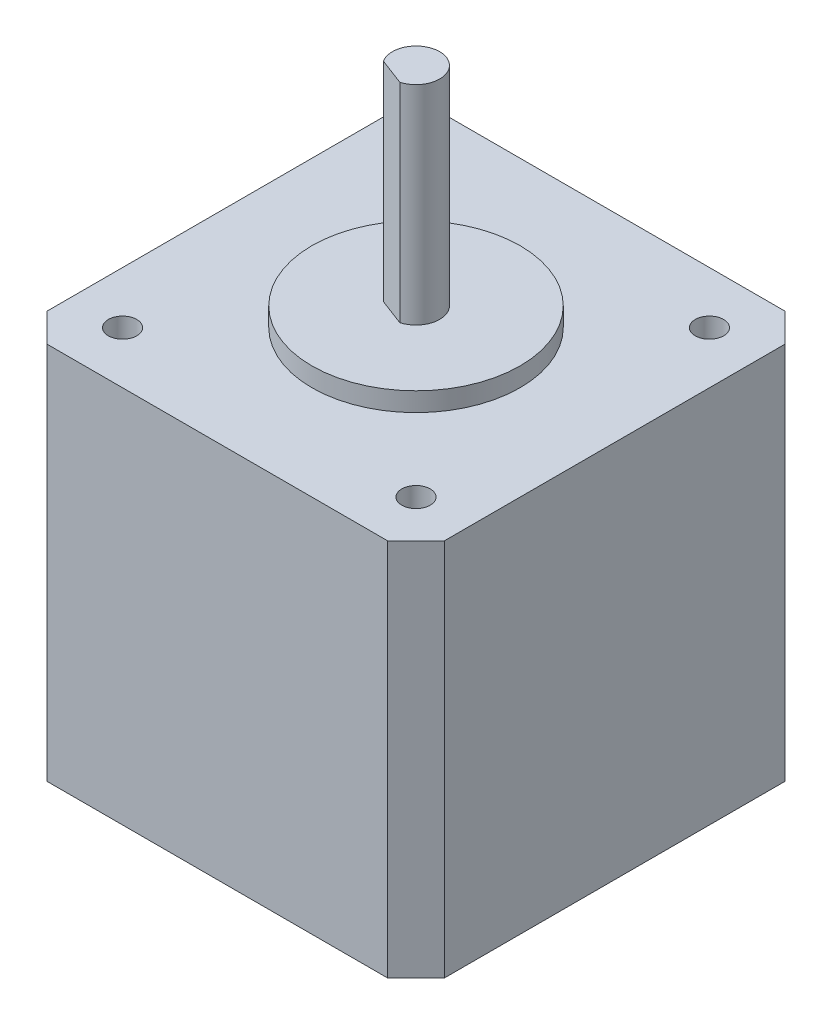
ISO-10303-21;
HEADER;
FILE_DESCRIPTION(('STEP AP214'),'2;1');
FILE_NAME('part.step','',(''),(''),'','','');
FILE_SCHEMA(('AUTOMOTIVE_DESIGN { 1 0 10303 214 1 1 1 1 }'));
ENDSEC;
DATA;
#1=APPLICATION_CONTEXT('core data for automotive mechanical design processes');
#2=APPLICATION_PROTOCOL_DEFINITION('international standard','automotive_design',2000,#1);
#3=PRODUCT_CONTEXT('',#1,'mechanical');
#4=PRODUCT('Part','Part','',(#3));
#5=PRODUCT_RELATED_PRODUCT_CATEGORY('part','',(#4));
#6=PRODUCT_DEFINITION_FORMATION('','',#4);
#7=PRODUCT_DEFINITION_CONTEXT('part definition',#1,'design');
#8=PRODUCT_DEFINITION('design','',#6,#7);
#9=PRODUCT_DEFINITION_SHAPE('','',#8);
#10=(LENGTH_UNIT() NAMED_UNIT(*) SI_UNIT(.MILLI.,.METRE.));
#11=(NAMED_UNIT(*) PLANE_ANGLE_UNIT() SI_UNIT($,.RADIAN.));
#12=(NAMED_UNIT(*) SI_UNIT($,.STERADIAN.) SOLID_ANGLE_UNIT());
#13=UNCERTAINTY_MEASURE_WITH_UNIT(LENGTH_MEASURE(1.E-05),#10,'distance_accuracy_value','');
#14=(GEOMETRIC_REPRESENTATION_CONTEXT(3) GLOBAL_UNCERTAINTY_ASSIGNED_CONTEXT((#13)) GLOBAL_UNIT_ASSIGNED_CONTEXT((#10,
#11,#12)) REPRESENTATION_CONTEXT('',''));
#15=CARTESIAN_POINT('',(0.,0.,0.));
#16=DIRECTION('',(0.,0.,1.));
#17=DIRECTION('',(1.,0.,0.));
#18=AXIS2_PLACEMENT_3D('',#15,#16,#17);
#19=CARTESIAN_POINT('',(21.,64.,-21.));
#20=DIRECTION('',(0.,-1.,0.));
#21=DIRECTION('',(0.,0.,-1.));
#22=AXIS2_PLACEMENT_3D('',#19,#20,#21);
#23=CYLINDRICAL_SURFACE('',#22,2.5);
#24=DIRECTION('',(0.,-1.,0.));
#25=VECTOR('',#24,1.);
#26=CARTESIAN_POINT('',(18.8861996608009,203.144399764715,-19.665141158773));
#27=LINE('',#26,#25);
#28=CARTESIAN_POINT('',(18.8861996608009,64.,-19.665141158773));
#29=VERTEX_POINT('',#28);
#30=CARTESIAN_POINT('',(18.8861996608009,42.,-19.665141158773));
#31=VERTEX_POINT('',#30);
#32=EDGE_CURVE('E121',#29,#31,#27,.T.);
#33=ORIENTED_EDGE('',*,*,#32,.F.);
#34=CARTESIAN_POINT('',(21.,64.,-21.));
#35=DIRECTION('',(0.,1.,0.));
#36=DIRECTION('',(0.,0.,1.));
#37=AXIS2_PLACEMENT_3D('',#34,#35,#36);
#38=CIRCLE('',#37,2.5);
#39=CARTESIAN_POINT('',(21.6896003926022,64.,-18.5969911988253));
#40=VERTEX_POINT('',#39);
#41=EDGE_CURVE('E131',#40,#29,#38,.T.);
#42=ORIENTED_EDGE('',*,*,#41,.F.);
#43=DIRECTION('',(0.,-1.,0.));
#44=VECTOR('',#43,1.);
#45=CARTESIAN_POINT('',(21.6896003926022,203.144399764715,-18.5969911988253));
#46=LINE('',#45,#44);
#47=CARTESIAN_POINT('',(21.6896003926022,42.,-18.5969911988253));
#48=VERTEX_POINT('',#47);
#49=EDGE_CURVE('E55',#40,#48,#46,.T.);
#50=ORIENTED_EDGE('',*,*,#49,.T.);
#51=CARTESIAN_POINT('',(21.,42.,-21.));
#52=DIRECTION('',(0.,1.,0.));
#53=DIRECTION('',(0.,0.,1.));
#54=AXIS2_PLACEMENT_3D('',#51,#52,#53);
#55=CIRCLE('',#54,2.5);
#56=EDGE_CURVE('E11',#48,#31,#55,.T.);
#57=ORIENTED_EDGE('',*,*,#56,.T.);
#58=EDGE_LOOP('',(#33,#42,#50,#57));
#59=FACE_BOUND('',#58,.T.);
#60=ADVANCED_FACE('F38',(#59),#23,.T.);
#61=CARTESIAN_POINT('',(21.,64.,-21.));
#62=DIRECTION('',(0.,1.,0.));
#63=DIRECTION('',(0.,0.,1.));
#64=AXIS2_PLACEMENT_3D('',#61,#62,#63);
#65=PLANE('',#64);
#66=ORIENTED_EDGE('',*,*,#41,.T.);
#67=DIRECTION('',(-0.934466910600416,0.,-0.356049986649227));
#68=VECTOR('',#67,1.);
#69=CARTESIAN_POINT('',(21.6896003926022,64.,-18.5969911988253));
#70=LINE('',#69,#68);
#71=EDGE_CURVE('E126',#40,#29,#70,.T.);
#72=ORIENTED_EDGE('',*,*,#71,.F.);
#73=EDGE_LOOP('',(#66,#72));
#74=FACE_BOUND('',#73,.T.);
#75=ADVANCED_FACE('F240',(#74),#65,.T.);
#76=CARTESIAN_POINT('',(0.,40.,0.));
#77=DIRECTION('',(1.,0.,0.));
#78=DIRECTION('',(0.,0.,-1.));
#79=AXIS2_PLACEMENT_3D('',#76,#77,#78);
#80=PLANE('',#79);
#81=DIRECTION('',(0.,0.,1.));
#82=VECTOR('',#81,1.);
#83=CARTESIAN_POINT('',(0.,40.,0.));
#84=LINE('',#83,#82);
#85=CARTESIAN_POINT('',(0.,40.,-39.));
#86=VERTEX_POINT('',#85);
#87=CARTESIAN_POINT('',(0.,40.,-3.00000000000002));
#88=VERTEX_POINT('',#87);
#89=EDGE_CURVE('E142',#86,#88,#84,.T.);
#90=ORIENTED_EDGE('',*,*,#89,.F.);
#91=DIRECTION('',(0.,-1.,0.));
#92=VECTOR('',#91,1.);
#93=CARTESIAN_POINT('',(0.,40.,-39.));
#94=LINE('',#93,#92);
#95=CARTESIAN_POINT('',(0.,0.,-39.));
#96=VERTEX_POINT('',#95);
#97=EDGE_CURVE('E191',#86,#96,#94,.T.);
#98=ORIENTED_EDGE('',*,*,#97,.T.);
#99=DIRECTION('',(0.,0.,1.));
#100=VECTOR('',#99,1.);
#101=CARTESIAN_POINT('',(0.,0.,0.));
#102=LINE('',#101,#100);
#103=CARTESIAN_POINT('',(0.,0.,-3.00000000000002));
#104=VERTEX_POINT('',#103);
#105=EDGE_CURVE('E139',#96,#104,#102,.T.);
#106=ORIENTED_EDGE('',*,*,#105,.T.);
#107=DIRECTION('',(0.,1.,0.));
#108=VECTOR('',#107,1.);
#109=CARTESIAN_POINT('',(0.,40.,-3.00000000000002));
#110=LINE('',#109,#108);
#111=EDGE_CURVE('E189',#104,#88,#110,.T.);
#112=ORIENTED_EDGE('',*,*,#111,.T.);
#113=EDGE_LOOP('',(#90,#98,#106,#112));
#114=FACE_BOUND('',#113,.T.);
#115=ADVANCED_FACE('F229',(#114),#80,.F.);
#116=CARTESIAN_POINT('',(0.,40.,0.));
#117=DIRECTION('',(0.,0.,-1.));
#118=DIRECTION('',(-1.,0.,0.));
#119=AXIS2_PLACEMENT_3D('',#116,#117,#118);
#120=PLANE('',#119);
#121=DIRECTION('',(1.,0.,0.));
#122=VECTOR('',#121,1.);
#123=CARTESIAN_POINT('',(0.,0.,0.));
#124=LINE('',#123,#122);
#125=CARTESIAN_POINT('',(3.,0.,0.));
#126=VERTEX_POINT('',#125);
#127=CARTESIAN_POINT('',(39.,0.,0.));
#128=VERTEX_POINT('',#127);
#129=EDGE_CURVE('E157',#126,#128,#124,.T.);
#130=ORIENTED_EDGE('',*,*,#129,.T.);
#131=DIRECTION('',(0.,1.,0.));
#132=VECTOR('',#131,1.);
#133=CARTESIAN_POINT('',(39.,40.,0.));
#134=LINE('',#133,#132);
#135=CARTESIAN_POINT('',(39.,40.,0.));
#136=VERTEX_POINT('',#135);
#137=EDGE_CURVE('E42',#128,#136,#134,.T.);
#138=ORIENTED_EDGE('',*,*,#137,.T.);
#139=DIRECTION('',(1.,0.,0.));
#140=VECTOR('',#139,1.);
#141=CARTESIAN_POINT('',(0.,40.,0.));
#142=LINE('',#141,#140);
#143=CARTESIAN_POINT('',(3.,40.,0.));
#144=VERTEX_POINT('',#143);
#145=EDGE_CURVE('E145',#144,#136,#142,.T.);
#146=ORIENTED_EDGE('',*,*,#145,.F.);
#147=DIRECTION('',(0.,-1.,0.));
#148=VECTOR('',#147,1.);
#149=CARTESIAN_POINT('',(3.,40.,0.));
#150=LINE('',#149,#148);
#151=EDGE_CURVE('E193',#144,#126,#150,.T.);
#152=ORIENTED_EDGE('',*,*,#151,.T.);
#153=EDGE_LOOP('',(#130,#138,#146,#152));
#154=FACE_BOUND('',#153,.T.);
#155=ADVANCED_FACE('F197',(#154),#120,.F.);
#156=CARTESIAN_POINT('',(42.,40.,0.));
#157=DIRECTION('',(-1.,0.,0.));
#158=DIRECTION('',(0.,0.,1.));
#159=AXIS2_PLACEMENT_3D('',#156,#157,#158);
#160=PLANE('',#159);
#161=DIRECTION('',(0.,0.,-1.));
#162=VECTOR('',#161,1.);
#163=CARTESIAN_POINT('',(42.,0.,0.));
#164=LINE('',#163,#162);
#165=CARTESIAN_POINT('',(42.,0.,-3.));
#166=VERTEX_POINT('',#165);
#167=CARTESIAN_POINT('',(42.,0.,-39.));
#168=VERTEX_POINT('',#167);
#169=EDGE_CURVE('E159',#166,#168,#164,.T.);
#170=ORIENTED_EDGE('',*,*,#169,.T.);
#171=DIRECTION('',(0.,1.,0.));
#172=VECTOR('',#171,1.);
#173=CARTESIAN_POINT('',(42.,40.,-39.));
#174=LINE('',#173,#172);
#175=CARTESIAN_POINT('',(42.,40.,-39.));
#176=VERTEX_POINT('',#175);
#177=EDGE_CURVE('E179',#168,#176,#174,.T.);
#178=ORIENTED_EDGE('',*,*,#177,.T.);
#179=DIRECTION('',(0.,0.,-1.));
#180=VECTOR('',#179,1.);
#181=CARTESIAN_POINT('',(42.,40.,0.));
#182=LINE('',#181,#180);
#183=CARTESIAN_POINT('',(42.,40.,-3.));
#184=VERTEX_POINT('',#183);
#185=EDGE_CURVE('E148',#184,#176,#182,.T.);
#186=ORIENTED_EDGE('',*,*,#185,.F.);
#187=DIRECTION('',(0.,-1.,0.));
#188=VECTOR('',#187,1.);
#189=CARTESIAN_POINT('',(42.,40.,-3.));
#190=LINE('',#189,#188);
#191=EDGE_CURVE('E176',#184,#166,#190,.T.);
#192=ORIENTED_EDGE('',*,*,#191,.T.);
#193=EDGE_LOOP('',(#170,#178,#186,#192));
#194=FACE_BOUND('',#193,.T.);
#195=ADVANCED_FACE('F211',(#194),#160,.F.);
#196=CARTESIAN_POINT('',(0.,40.,-42.));
#197=DIRECTION('',(0.,0.,1.));
#198=DIRECTION('',(1.,0.,0.));
#199=AXIS2_PLACEMENT_3D('',#196,#197,#198);
#200=PLANE('',#199);
#201=DIRECTION('',(-1.,0.,0.));
#202=VECTOR('',#201,1.);
#203=CARTESIAN_POINT('',(0.,40.,-42.));
#204=LINE('',#203,#202);
#205=CARTESIAN_POINT('',(39.,40.,-42.));
#206=VERTEX_POINT('',#205);
#207=CARTESIAN_POINT('',(3.00000000000001,40.,-42.));
#208=VERTEX_POINT('',#207);
#209=EDGE_CURVE('E151',#206,#208,#204,.T.);
#210=ORIENTED_EDGE('',*,*,#209,.F.);
#211=DIRECTION('',(0.,-1.,0.));
#212=VECTOR('',#211,1.);
#213=CARTESIAN_POINT('',(39.,40.,-42.));
#214=LINE('',#213,#212);
#215=CARTESIAN_POINT('',(39.,0.,-42.));
#216=VERTEX_POINT('',#215);
#217=EDGE_CURVE('E165',#206,#216,#214,.T.);
#218=ORIENTED_EDGE('',*,*,#217,.T.);
#219=DIRECTION('',(-1.,0.,0.));
#220=VECTOR('',#219,1.);
#221=CARTESIAN_POINT('',(0.,0.,-42.));
#222=LINE('',#221,#220);
#223=CARTESIAN_POINT('',(3.00000000000001,0.,-42.));
#224=VERTEX_POINT('',#223);
#225=EDGE_CURVE('E146',#216,#224,#222,.T.);
#226=ORIENTED_EDGE('',*,*,#225,.T.);
#227=DIRECTION('',(0.,1.,0.));
#228=VECTOR('',#227,1.);
#229=CARTESIAN_POINT('',(3.00000000000001,40.,-42.));
#230=LINE('',#229,#228);
#231=EDGE_CURVE('E154',#224,#208,#230,.T.);
#232=ORIENTED_EDGE('',*,*,#231,.T.);
#233=EDGE_LOOP('',(#210,#218,#226,#232));
#234=FACE_BOUND('',#233,.T.);
#235=ADVANCED_FACE('F221',(#234),#200,.F.);
#236=CARTESIAN_POINT('',(0.,40.,0.));
#237=DIRECTION('',(0.,-1.,0.));
#238=DIRECTION('',(0.,0.,-1.));
#239=AXIS2_PLACEMENT_3D('',#236,#237,#238);
#240=PLANE('',#239);
#241=CARTESIAN_POINT('',(5.50000000000001,40.,-5.49999999999999));
#242=DIRECTION('',(0.,1.,0.));
#243=DIRECTION('',(0.,0.,1.));
#244=AXIS2_PLACEMENT_3D('',#241,#242,#243);
#245=CIRCLE('',#244,1.5);
#246=CARTESIAN_POINT('',(5.50000000000001,40.,-3.99999999999999));
#247=VERTEX_POINT('',#246);
#248=EDGE_CURVE('E400',#247,#247,#245,.T.);
#249=ORIENTED_EDGE('',*,*,#248,.F.);
#250=EDGE_LOOP('',(#249));
#251=FACE_BOUND('',#250,.T.);
#252=CARTESIAN_POINT('',(36.5,40.,-5.49999999999999));
#253=DIRECTION('',(0.,1.,0.));
#254=DIRECTION('',(0.,0.,1.));
#255=AXIS2_PLACEMENT_3D('',#252,#253,#254);
#256=CIRCLE('',#255,1.5);
#257=CARTESIAN_POINT('',(36.5,40.,-3.99999999999999));
#258=VERTEX_POINT('',#257);
#259=EDGE_CURVE('E420',#258,#258,#256,.T.);
#260=ORIENTED_EDGE('',*,*,#259,.F.);
#261=EDGE_LOOP('',(#260));
#262=FACE_BOUND('',#261,.T.);
#263=CARTESIAN_POINT('',(36.5,40.,-36.5));
#264=DIRECTION('',(0.,1.,0.));
#265=DIRECTION('',(0.,0.,1.));
#266=AXIS2_PLACEMENT_3D('',#263,#264,#265);
#267=CIRCLE('',#266,1.5);
#268=CARTESIAN_POINT('',(36.5,40.,-35.));
#269=VERTEX_POINT('',#268);
#270=EDGE_CURVE('E411',#269,#269,#267,.T.);
#271=ORIENTED_EDGE('',*,*,#270,.F.);
#272=EDGE_LOOP('',(#271));
#273=FACE_BOUND('',#272,.T.);
#274=CARTESIAN_POINT('',(5.50000000000001,40.,-36.5));
#275=DIRECTION('',(0.,1.,0.));
#276=DIRECTION('',(0.,0.,1.));
#277=AXIS2_PLACEMENT_3D('',#274,#275,#276);
#278=CIRCLE('',#277,1.5);
#279=CARTESIAN_POINT('',(5.50000000000001,40.,-35.));
#280=VERTEX_POINT('',#279);
#281=EDGE_CURVE('E409',#280,#280,#278,.T.);
#282=ORIENTED_EDGE('',*,*,#281,.F.);
#283=EDGE_LOOP('',(#282));
#284=FACE_BOUND('',#283,.T.);
#285=CARTESIAN_POINT('',(21.,40.,-21.));
#286=DIRECTION('',(0.,1.,0.));
#287=DIRECTION('',(0.,0.,1.));
#288=AXIS2_PLACEMENT_3D('',#285,#286,#287);
#289=CIRCLE('',#288,11.);
#290=CARTESIAN_POINT('',(21.,40.,-9.99999999999999));
#291=VERTEX_POINT('',#290);
#292=EDGE_CURVE('E47',#291,#291,#289,.T.);
#293=ORIENTED_EDGE('',*,*,#292,.F.);
#294=EDGE_LOOP('',(#293));
#295=FACE_BOUND('',#294,.T.);
#296=ORIENTED_EDGE('',*,*,#185,.T.);
#297=DIRECTION('',(0.707106781186545,0.,0.70710678118655));
#298=VECTOR('',#297,1.);
#299=CARTESIAN_POINT('',(39.,40.,-42.));
#300=LINE('',#299,#298);
#301=EDGE_CURVE('E187',#176,#206,#300,.F.);
#302=ORIENTED_EDGE('',*,*,#301,.T.);
#303=ORIENTED_EDGE('',*,*,#209,.T.);
#304=DIRECTION('',(0.70710678118655,0.,-0.707106781186545));
#305=VECTOR('',#304,1.);
#306=CARTESIAN_POINT('',(0.,40.,-39.));
#307=LINE('',#306,#305);
#308=EDGE_CURVE('E185',#208,#86,#307,.F.);
#309=ORIENTED_EDGE('',*,*,#308,.T.);
#310=ORIENTED_EDGE('',*,*,#89,.T.);
#311=DIRECTION('',(-0.707106781186546,0.,-0.707106781186549));
#312=VECTOR('',#311,1.);
#313=CARTESIAN_POINT('',(3.,40.,0.));
#314=LINE('',#313,#312);
#315=EDGE_CURVE('E181',#88,#144,#314,.F.);
#316=ORIENTED_EDGE('',*,*,#315,.T.);
#317=ORIENTED_EDGE('',*,*,#145,.T.);
#318=DIRECTION('',(-0.707106781186549,0.,0.707106781186546));
#319=VECTOR('',#318,1.);
#320=CARTESIAN_POINT('',(42.,40.,-3.));
#321=LINE('',#320,#319);
#322=EDGE_CURVE('E183',#136,#184,#321,.F.);
#323=ORIENTED_EDGE('',*,*,#322,.T.);
#324=EDGE_LOOP('',(#296,#302,#303,#309,#310,#316,#317,#323));
#325=FACE_BOUND('',#324,.T.);
#326=ADVANCED_FACE('F215',(#251,#262,#273,#284,#295,#325),#240,.F.);
#327=CARTESIAN_POINT('',(0.,0.,0.));
#328=DIRECTION('',(0.,-1.,0.));
#329=DIRECTION('',(0.,0.,-1.));
#330=AXIS2_PLACEMENT_3D('',#327,#328,#329);
#331=PLANE('',#330);
#332=ORIENTED_EDGE('',*,*,#225,.F.);
#333=DIRECTION('',(-0.707106781186545,0.,-0.70710678118655));
#334=VECTOR('',#333,1.);
#335=CARTESIAN_POINT('',(40.5000000000001,0.,-40.4999999999999));
#336=LINE('',#335,#334);
#337=EDGE_CURVE('E174',#216,#168,#336,.F.);
#338=ORIENTED_EDGE('',*,*,#337,.T.);
#339=ORIENTED_EDGE('',*,*,#169,.F.);
#340=DIRECTION('',(0.707106781186549,0.,-0.707106781186546));
#341=VECTOR('',#340,1.);
#342=CARTESIAN_POINT('',(19.4999999999999,0.,19.5));
#343=LINE('',#342,#341);
#344=EDGE_CURVE('E170',#166,#128,#343,.F.);
#345=ORIENTED_EDGE('',*,*,#344,.T.);
#346=ORIENTED_EDGE('',*,*,#129,.F.);
#347=DIRECTION('',(0.707106781186546,0.,0.707106781186549));
#348=VECTOR('',#347,1.);
#349=CARTESIAN_POINT('',(1.50000000000001,0.,-1.5));
#350=LINE('',#349,#348);
#351=EDGE_CURVE('E168',#126,#104,#350,.F.);
#352=ORIENTED_EDGE('',*,*,#351,.T.);
#353=ORIENTED_EDGE('',*,*,#105,.F.);
#354=DIRECTION('',(-0.70710678118655,0.,0.707106781186545));
#355=VECTOR('',#354,1.);
#356=CARTESIAN_POINT('',(-19.5,0.,-19.5000000000001));
#357=LINE('',#356,#355);
#358=EDGE_CURVE('E172',#96,#224,#357,.F.);
#359=ORIENTED_EDGE('',*,*,#358,.T.);
#360=EDGE_LOOP('',(#332,#338,#339,#345,#346,#352,#353,#359));
#361=FACE_BOUND('',#360,.T.);
#362=ADVANCED_FACE('F202',(#361),#331,.T.);
#363=CARTESIAN_POINT('',(39.,40.,-42.));
#364=DIRECTION('',(-0.70710678118655,0.,0.707106781186545));
#365=DIRECTION('',(0.,-1.,0.));
#366=AXIS2_PLACEMENT_3D('',#363,#364,#365);
#367=PLANE('',#366);
#368=ORIENTED_EDGE('',*,*,#301,.F.);
#369=ORIENTED_EDGE('',*,*,#177,.F.);
#370=ORIENTED_EDGE('',*,*,#337,.F.);
#371=ORIENTED_EDGE('',*,*,#217,.F.);
#372=EDGE_LOOP('',(#368,#369,#370,#371));
#373=FACE_BOUND('',#372,.T.);
#374=ADVANCED_FACE('F219',(#373),#367,.F.);
#375=CARTESIAN_POINT('',(0.,40.,-39.));
#376=DIRECTION('',(0.707106781186545,0.,0.70710678118655));
#377=DIRECTION('',(0.,-1.,0.));
#378=AXIS2_PLACEMENT_3D('',#375,#376,#377);
#379=PLANE('',#378);
#380=ORIENTED_EDGE('',*,*,#308,.F.);
#381=ORIENTED_EDGE('',*,*,#231,.F.);
#382=ORIENTED_EDGE('',*,*,#358,.F.);
#383=ORIENTED_EDGE('',*,*,#97,.F.);
#384=EDGE_LOOP('',(#380,#381,#382,#383));
#385=FACE_BOUND('',#384,.T.);
#386=ADVANCED_FACE('F226',(#385),#379,.F.);
#387=CARTESIAN_POINT('',(42.,40.,-3.));
#388=DIRECTION('',(-0.707106781186546,0.,-0.707106781186549));
#389=DIRECTION('',(0.,-1.,0.));
#390=AXIS2_PLACEMENT_3D('',#387,#388,#389);
#391=PLANE('',#390);
#392=ORIENTED_EDGE('',*,*,#322,.F.);
#393=ORIENTED_EDGE('',*,*,#137,.F.);
#394=ORIENTED_EDGE('',*,*,#344,.F.);
#395=ORIENTED_EDGE('',*,*,#191,.F.);
#396=EDGE_LOOP('',(#392,#393,#394,#395));
#397=FACE_BOUND('',#396,.T.);
#398=ADVANCED_FACE('F208',(#397),#391,.F.);
#399=CARTESIAN_POINT('',(3.,40.,0.));
#400=DIRECTION('',(0.707106781186549,0.,-0.707106781186546));
#401=DIRECTION('',(0.,-1.,0.));
#402=AXIS2_PLACEMENT_3D('',#399,#400,#401);
#403=PLANE('',#402);
#404=ORIENTED_EDGE('',*,*,#315,.F.);
#405=ORIENTED_EDGE('',*,*,#111,.F.);
#406=ORIENTED_EDGE('',*,*,#351,.F.);
#407=ORIENTED_EDGE('',*,*,#151,.F.);
#408=EDGE_LOOP('',(#404,#405,#406,#407));
#409=FACE_BOUND('',#408,.T.);
#410=ADVANCED_FACE('F40',(#409),#403,.F.);
#411=CARTESIAN_POINT('',(21.,42.,-21.));
#412=DIRECTION('',(0.,-1.,0.));
#413=DIRECTION('',(0.,0.,-1.));
#414=AXIS2_PLACEMENT_3D('',#411,#412,#413);
#415=CYLINDRICAL_SURFACE('',#414,11.);
#416=CARTESIAN_POINT('',(21.,42.,-21.));
#417=DIRECTION('',(0.,1.,0.));
#418=DIRECTION('',(0.,0.,1.));
#419=AXIS2_PLACEMENT_3D('',#416,#417,#418);
#420=CIRCLE('',#419,11.);
#421=CARTESIAN_POINT('',(21.,42.,-9.99999999999999));
#422=VERTEX_POINT('',#421);
#423=EDGE_CURVE('E135',#422,#422,#420,.T.);
#424=ORIENTED_EDGE('',*,*,#423,.F.);
#425=EDGE_LOOP('',(#424));
#426=FACE_BOUND('',#425,.T.);
#427=ORIENTED_EDGE('',*,*,#292,.T.);
#428=EDGE_LOOP('',(#427));
#429=FACE_BOUND('',#428,.T.);
#430=ADVANCED_FACE('F232',(#426,#429),#415,.T.);
#431=CARTESIAN_POINT('',(21.,42.,-21.));
#432=DIRECTION('',(0.,1.,0.));
#433=DIRECTION('',(0.,0.,1.));
#434=AXIS2_PLACEMENT_3D('',#431,#432,#433);
#435=PLANE('',#434);
#436=ORIENTED_EDGE('',*,*,#56,.F.);
#437=DIRECTION('',(-0.934466910600416,0.,-0.356049986649227));
#438=VECTOR('',#437,1.);
#439=CARTESIAN_POINT('',(21.6896003926022,42.,-18.5969911988253));
#440=LINE('',#439,#438);
#441=EDGE_CURVE('E117',#48,#31,#440,.T.);
#442=ORIENTED_EDGE('',*,*,#441,.T.);
#443=EDGE_LOOP('',(#436,#442));
#444=FACE_BOUND('',#443,.T.);
#445=ORIENTED_EDGE('',*,*,#423,.T.);
#446=EDGE_LOOP('',(#445));
#447=FACE_BOUND('',#446,.T.);
#448=ADVANCED_FACE('F119',(#444,#447),#435,.T.);
#449=CARTESIAN_POINT('',(21.6896003926022,203.144399764715,-18.5969911988253));
#450=DIRECTION('',(-0.356049986649227,0.,0.934466910600416));
#451=DIRECTION('',(0.934466910600416,0.,0.356049986649227));
#452=AXIS2_PLACEMENT_3D('',#449,#450,#451);
#453=PLANE('',#452);
#454=ORIENTED_EDGE('',*,*,#49,.F.);
#455=ORIENTED_EDGE('',*,*,#71,.T.);
#456=ORIENTED_EDGE('',*,*,#32,.T.);
#457=ORIENTED_EDGE('',*,*,#441,.F.);
#458=EDGE_LOOP('',(#454,#455,#456,#457));
#459=FACE_BOUND('',#458,.T.);
#460=ADVANCED_FACE('F125',(#459),#453,.T.);
#461=CARTESIAN_POINT('',(5.50000000000001,30.,-36.5));
#462=DIRECTION('',(0.,1.,0.));
#463=DIRECTION('',(0.,0.,1.));
#464=AXIS2_PLACEMENT_3D('',#461,#462,#463);
#465=CYLINDRICAL_SURFACE('',#464,1.5);
#466=CARTESIAN_POINT('',(5.50000000000001,30.,-36.5));
#467=DIRECTION('',(0.,1.,0.));
#468=DIRECTION('',(0.,0.,1.));
#469=AXIS2_PLACEMENT_3D('',#466,#467,#468);
#470=CIRCLE('',#469,1.5);
#471=CARTESIAN_POINT('',(5.50000000000001,30.,-35.));
#472=VERTEX_POINT('',#471);
#473=EDGE_CURVE('E122',#472,#472,#470,.T.);
#474=ORIENTED_EDGE('',*,*,#473,.F.);
#475=EDGE_LOOP('',(#474));
#476=FACE_BOUND('',#475,.T.);
#477=ORIENTED_EDGE('',*,*,#281,.T.);
#478=EDGE_LOOP('',(#477));
#479=FACE_BOUND('',#478,.T.);
#480=ADVANCED_FACE('F310',(#476,#479),#465,.F.);
#481=CARTESIAN_POINT('',(5.50000000000001,30.,-36.5));
#482=DIRECTION('',(0.,1.,0.));
#483=DIRECTION('',(0.,0.,1.));
#484=AXIS2_PLACEMENT_3D('',#481,#482,#483);
#485=PLANE('',#484);
#486=ORIENTED_EDGE('',*,*,#473,.T.);
#487=EDGE_LOOP('',(#486));
#488=FACE_BOUND('',#487,.T.);
#489=ADVANCED_FACE('F323',(#488),#485,.T.);
#490=CARTESIAN_POINT('',(36.5,30.,-36.5));
#491=DIRECTION('',(0.,1.,0.));
#492=DIRECTION('',(0.,0.,1.));
#493=AXIS2_PLACEMENT_3D('',#490,#491,#492);
#494=CYLINDRICAL_SURFACE('',#493,1.5);
#495=CARTESIAN_POINT('',(36.5,30.,-36.5));
#496=DIRECTION('',(0.,1.,0.));
#497=DIRECTION('',(0.,0.,1.));
#498=AXIS2_PLACEMENT_3D('',#495,#496,#497);
#499=CIRCLE('',#498,1.5);
#500=CARTESIAN_POINT('',(36.5,30.,-35.));
#501=VERTEX_POINT('',#500);
#502=EDGE_CURVE('E415',#501,#501,#499,.T.);
#503=ORIENTED_EDGE('',*,*,#502,.F.);
#504=EDGE_LOOP('',(#503));
#505=FACE_BOUND('',#504,.T.);
#506=ORIENTED_EDGE('',*,*,#270,.T.);
#507=EDGE_LOOP('',(#506));
#508=FACE_BOUND('',#507,.T.);
#509=ADVANCED_FACE('F333',(#505,#508),#494,.F.);
#510=CARTESIAN_POINT('',(36.5,30.,-36.5));
#511=DIRECTION('',(0.,1.,0.));
#512=DIRECTION('',(0.,0.,1.));
#513=AXIS2_PLACEMENT_3D('',#510,#511,#512);
#514=PLANE('',#513);
#515=ORIENTED_EDGE('',*,*,#502,.T.);
#516=EDGE_LOOP('',(#515));
#517=FACE_BOUND('',#516,.T.);
#518=ADVANCED_FACE('F343',(#517),#514,.T.);
#519=CARTESIAN_POINT('',(36.5,30.,-5.49999999999999));
#520=DIRECTION('',(0.,1.,0.));
#521=DIRECTION('',(0.,0.,1.));
#522=AXIS2_PLACEMENT_3D('',#519,#520,#521);
#523=CYLINDRICAL_SURFACE('',#522,1.5);
#524=CARTESIAN_POINT('',(36.5,30.,-5.49999999999999));
#525=DIRECTION('',(0.,1.,0.));
#526=DIRECTION('',(0.,0.,1.));
#527=AXIS2_PLACEMENT_3D('',#524,#525,#526);
#528=CIRCLE('',#527,1.5);
#529=CARTESIAN_POINT('',(36.5,30.,-3.99999999999999));
#530=VERTEX_POINT('',#529);
#531=EDGE_CURVE('E403',#530,#530,#528,.T.);
#532=ORIENTED_EDGE('',*,*,#531,.F.);
#533=EDGE_LOOP('',(#532));
#534=FACE_BOUND('',#533,.T.);
#535=ORIENTED_EDGE('',*,*,#259,.T.);
#536=EDGE_LOOP('',(#535));
#537=FACE_BOUND('',#536,.T.);
#538=ADVANCED_FACE('F353',(#534,#537),#523,.F.);
#539=CARTESIAN_POINT('',(36.5,30.,-5.49999999999999));
#540=DIRECTION('',(0.,1.,0.));
#541=DIRECTION('',(0.,0.,1.));
#542=AXIS2_PLACEMENT_3D('',#539,#540,#541);
#543=PLANE('',#542);
#544=ORIENTED_EDGE('',*,*,#531,.T.);
#545=EDGE_LOOP('',(#544));
#546=FACE_BOUND('',#545,.T.);
#547=ADVANCED_FACE('F363',(#546),#543,.T.);
#548=CARTESIAN_POINT('',(5.50000000000001,30.,-5.49999999999999));
#549=DIRECTION('',(0.,1.,0.));
#550=DIRECTION('',(0.,0.,1.));
#551=AXIS2_PLACEMENT_3D('',#548,#549,#550);
#552=CYLINDRICAL_SURFACE('',#551,1.5);
#553=CARTESIAN_POINT('',(5.50000000000001,30.,-5.49999999999999));
#554=DIRECTION('',(0.,1.,0.));
#555=DIRECTION('',(0.,0.,1.));
#556=AXIS2_PLACEMENT_3D('',#553,#554,#555);
#557=CIRCLE('',#556,1.5);
#558=CARTESIAN_POINT('',(5.50000000000001,30.,-3.99999999999999));
#559=VERTEX_POINT('',#558);
#560=EDGE_CURVE('E399',#559,#559,#557,.T.);
#561=ORIENTED_EDGE('',*,*,#560,.F.);
#562=EDGE_LOOP('',(#561));
#563=FACE_BOUND('',#562,.T.);
#564=ORIENTED_EDGE('',*,*,#248,.T.);
#565=EDGE_LOOP('',(#564));
#566=FACE_BOUND('',#565,.T.);
#567=ADVANCED_FACE('F373',(#563,#566),#552,.F.);
#568=CARTESIAN_POINT('',(5.50000000000001,30.,-5.49999999999999));
#569=DIRECTION('',(0.,1.,0.));
#570=DIRECTION('',(0.,0.,1.));
#571=AXIS2_PLACEMENT_3D('',#568,#569,#570);
#572=PLANE('',#571);
#573=ORIENTED_EDGE('',*,*,#560,.T.);
#574=EDGE_LOOP('',(#573));
#575=FACE_BOUND('',#574,.T.);
#576=ADVANCED_FACE('F383',(#575),#572,.T.);
#577=CLOSED_SHELL('',(#60,#75,#115,#155,#195,#235,#326,#362,#374,#386,#398,#410,#430,#448,#460,
#480,#489,#509,#518,#538,#547,#567,#576));
#578=MANIFOLD_SOLID_BREP('B2',#577);
#579=ADVANCED_BREP_SHAPE_REPRESENTATION('',(#18,#578),#14);
#580=SHAPE_DEFINITION_REPRESENTATION(#9,#579);
ENDSEC;
END-ISO-10303-21;
